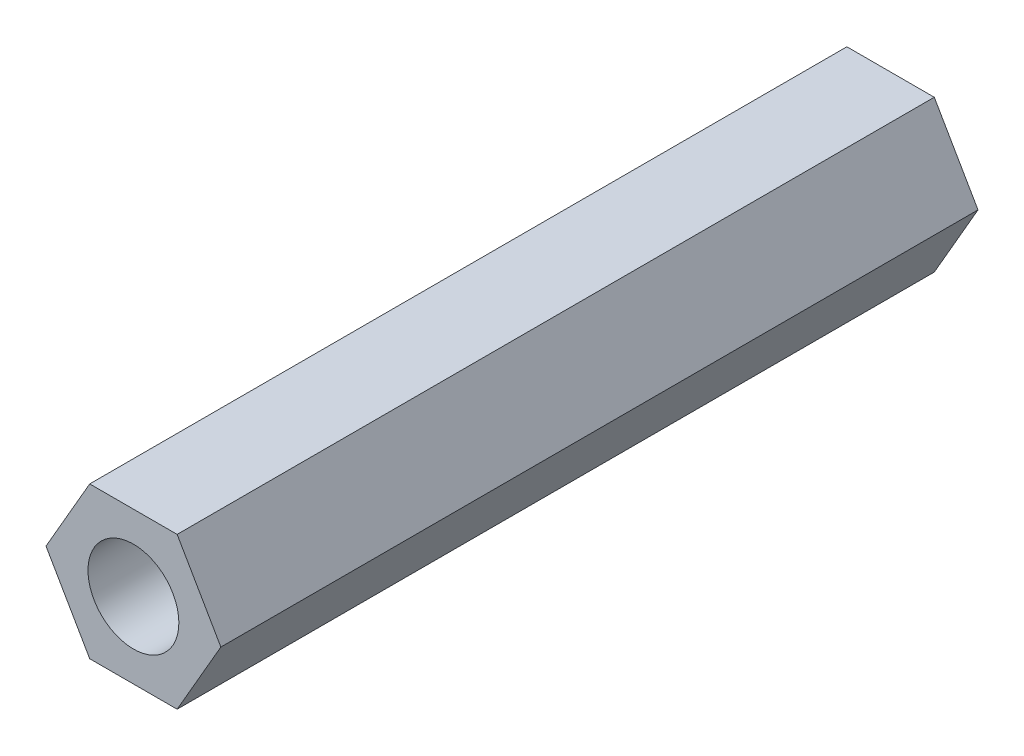
ISO-10303-21;
HEADER;
FILE_DESCRIPTION(('STEP AP214'),'2;1');
FILE_NAME('part.step','',(''),(''),'','','');
FILE_SCHEMA(('AUTOMOTIVE_DESIGN { 1 0 10303 214 1 1 1 1 }'));
ENDSEC;
DATA;
#1=APPLICATION_CONTEXT('core data for automotive mechanical design processes');
#2=APPLICATION_PROTOCOL_DEFINITION('international standard','automotive_design',2000,#1);
#3=PRODUCT_CONTEXT('',#1,'mechanical');
#4=PRODUCT('Part','Part','',(#3));
#5=PRODUCT_RELATED_PRODUCT_CATEGORY('part','',(#4));
#6=PRODUCT_DEFINITION_FORMATION('','',#4);
#7=PRODUCT_DEFINITION_CONTEXT('part definition',#1,'design');
#8=PRODUCT_DEFINITION('design','',#6,#7);
#9=PRODUCT_DEFINITION_SHAPE('','',#8);
#10=(LENGTH_UNIT() NAMED_UNIT(*) SI_UNIT(.MILLI.,.METRE.));
#11=(NAMED_UNIT(*) PLANE_ANGLE_UNIT() SI_UNIT($,.RADIAN.));
#12=(NAMED_UNIT(*) SI_UNIT($,.STERADIAN.) SOLID_ANGLE_UNIT());
#13=UNCERTAINTY_MEASURE_WITH_UNIT(LENGTH_MEASURE(1.E-05),#10,'distance_accuracy_value','');
#14=(GEOMETRIC_REPRESENTATION_CONTEXT(3) GLOBAL_UNCERTAINTY_ASSIGNED_CONTEXT((#13)) GLOBAL_UNIT_ASSIGNED_CONTEXT((#10,
#11,#12)) REPRESENTATION_CONTEXT('',''));
#15=CARTESIAN_POINT('',(0.,0.,0.));
#16=DIRECTION('',(0.,0.,1.));
#17=DIRECTION('',(1.,0.,0.));
#18=AXIS2_PLACEMENT_3D('',#15,#16,#17);
#19=CARTESIAN_POINT('',(0.,0.,25.));
#20=DIRECTION('',(0.,0.,1.));
#21=DIRECTION('',(1.,0.,0.));
#22=AXIS2_PLACEMENT_3D('',#19,#20,#21);
#23=PLANE('',#22);
#24=DIRECTION('',(1.,0.,0.));
#25=VECTOR('',#24,1.);
#26=CARTESIAN_POINT('',(-1.44337567297407,-2.5,25.));
#27=LINE('',#26,#25);
#28=CARTESIAN_POINT('',(-1.44337567297407,-2.5,25.));
#29=VERTEX_POINT('',#28);
#30=CARTESIAN_POINT('',(1.44337567297406,-2.5,25.));
#31=VERTEX_POINT('',#30);
#32=EDGE_CURVE('E133',#29,#31,#27,.T.);
#33=ORIENTED_EDGE('',*,*,#32,.T.);
#34=DIRECTION('',(0.5,0.866025403784438,0.));
#35=VECTOR('',#34,1.);
#36=CARTESIAN_POINT('',(1.44337567297406,-2.5,25.));
#37=LINE('',#36,#35);
#38=CARTESIAN_POINT('',(2.88675134594813,0.,25.));
#39=VERTEX_POINT('',#38);
#40=EDGE_CURVE('E91',#31,#39,#37,.T.);
#41=ORIENTED_EDGE('',*,*,#40,.T.);
#42=DIRECTION('',(-0.5,0.866025403784438,0.));
#43=VECTOR('',#42,1.);
#44=CARTESIAN_POINT('',(2.88675134594813,0.,25.));
#45=LINE('',#44,#43);
#46=CARTESIAN_POINT('',(1.44337567297406,2.5,25.));
#47=VERTEX_POINT('',#46);
#48=EDGE_CURVE('E104',#39,#47,#45,.T.);
#49=ORIENTED_EDGE('',*,*,#48,.T.);
#50=DIRECTION('',(-1.,0.,0.));
#51=VECTOR('',#50,1.);
#52=CARTESIAN_POINT('',(1.44337567297406,2.5,25.));
#53=LINE('',#52,#51);
#54=CARTESIAN_POINT('',(-1.44337567297407,2.5,25.));
#55=VERTEX_POINT('',#54);
#56=EDGE_CURVE('E98',#47,#55,#53,.T.);
#57=ORIENTED_EDGE('',*,*,#56,.T.);
#58=DIRECTION('',(-0.5,-0.866025403784439,0.));
#59=VECTOR('',#58,1.);
#60=CARTESIAN_POINT('',(-1.44337567297407,2.5,25.));
#61=LINE('',#60,#59);
#62=CARTESIAN_POINT('',(-2.88675134594813,0.,25.));
#63=VERTEX_POINT('',#62);
#64=EDGE_CURVE('E102',#55,#63,#61,.T.);
#65=ORIENTED_EDGE('',*,*,#64,.T.);
#66=DIRECTION('',(0.5,-0.866025403784439,0.));
#67=VECTOR('',#66,1.);
#68=CARTESIAN_POINT('',(-2.88675134594813,0.,25.));
#69=LINE('',#68,#67);
#70=EDGE_CURVE('E54',#63,#29,#69,.T.);
#71=ORIENTED_EDGE('',*,*,#70,.T.);
#72=EDGE_LOOP('',(#33,#41,#49,#57,#65,#71));
#73=FACE_BOUND('',#72,.T.);
#74=CARTESIAN_POINT('',(0.,0.,25.));
#75=DIRECTION('',(0.,0.,1.));
#76=DIRECTION('',(1.,0.,0.));
#77=AXIS2_PLACEMENT_3D('',#74,#75,#76);
#78=CIRCLE('',#77,1.5);
#79=CARTESIAN_POINT('',(1.5,0.,25.));
#80=VERTEX_POINT('',#79);
#81=EDGE_CURVE('E126',#80,#80,#78,.T.);
#82=ORIENTED_EDGE('',*,*,#81,.F.);
#83=EDGE_LOOP('',(#82));
#84=FACE_BOUND('',#83,.T.);
#85=ADVANCED_FACE('F37',(#73,#84),#23,.T.);
#86=CARTESIAN_POINT('',(0.,0.,0.));
#87=DIRECTION('',(0.,0.,1.));
#88=DIRECTION('',(1.,0.,0.));
#89=AXIS2_PLACEMENT_3D('',#86,#87,#88);
#90=PLANE('',#89);
#91=DIRECTION('',(1.,0.,0.));
#92=VECTOR('',#91,1.);
#93=CARTESIAN_POINT('',(-1.44337567297407,-2.5,0.));
#94=LINE('',#93,#92);
#95=CARTESIAN_POINT('',(-1.44337567297407,-2.5,0.));
#96=VERTEX_POINT('',#95);
#97=CARTESIAN_POINT('',(1.44337567297406,-2.5,0.));
#98=VERTEX_POINT('',#97);
#99=EDGE_CURVE('E122',#96,#98,#94,.T.);
#100=ORIENTED_EDGE('',*,*,#99,.F.);
#101=DIRECTION('',(0.5,-0.866025403784439,0.));
#102=VECTOR('',#101,1.);
#103=CARTESIAN_POINT('',(-2.88675134594813,0.,0.));
#104=LINE('',#103,#102);
#105=CARTESIAN_POINT('',(-2.88675134594813,0.,0.));
#106=VERTEX_POINT('',#105);
#107=EDGE_CURVE('E83',#106,#96,#104,.T.);
#108=ORIENTED_EDGE('',*,*,#107,.F.);
#109=DIRECTION('',(-0.5,-0.866025403784439,0.));
#110=VECTOR('',#109,1.);
#111=CARTESIAN_POINT('',(-1.44337567297407,2.5,0.));
#112=LINE('',#111,#110);
#113=CARTESIAN_POINT('',(-1.44337567297407,2.5,0.));
#114=VERTEX_POINT('',#113);
#115=EDGE_CURVE('E77',#114,#106,#112,.T.);
#116=ORIENTED_EDGE('',*,*,#115,.F.);
#117=DIRECTION('',(-1.,0.,0.));
#118=VECTOR('',#117,1.);
#119=CARTESIAN_POINT('',(1.44337567297406,2.5,0.));
#120=LINE('',#119,#118);
#121=CARTESIAN_POINT('',(1.44337567297406,2.5,0.));
#122=VERTEX_POINT('',#121);
#123=EDGE_CURVE('E112',#122,#114,#120,.T.);
#124=ORIENTED_EDGE('',*,*,#123,.F.);
#125=DIRECTION('',(-0.5,0.866025403784438,0.));
#126=VECTOR('',#125,1.);
#127=CARTESIAN_POINT('',(2.88675134594813,0.,0.));
#128=LINE('',#127,#126);
#129=CARTESIAN_POINT('',(2.88675134594813,0.,0.));
#130=VERTEX_POINT('',#129);
#131=EDGE_CURVE('E128',#130,#122,#128,.T.);
#132=ORIENTED_EDGE('',*,*,#131,.F.);
#133=DIRECTION('',(0.5,0.866025403784438,0.));
#134=VECTOR('',#133,1.);
#135=CARTESIAN_POINT('',(1.44337567297406,-2.5,0.));
#136=LINE('',#135,#134);
#137=EDGE_CURVE('E125',#98,#130,#136,.T.);
#138=ORIENTED_EDGE('',*,*,#137,.F.);
#139=EDGE_LOOP('',(#100,#108,#116,#124,#132,#138));
#140=FACE_BOUND('',#139,.T.);
#141=CARTESIAN_POINT('',(0.,0.,0.));
#142=DIRECTION('',(0.,0.,1.));
#143=DIRECTION('',(1.,0.,0.));
#144=AXIS2_PLACEMENT_3D('',#141,#142,#143);
#145=CIRCLE('',#144,1.5);
#146=CARTESIAN_POINT('',(1.5,0.,0.));
#147=VERTEX_POINT('',#146);
#148=EDGE_CURVE('E226',#147,#147,#145,.T.);
#149=ORIENTED_EDGE('',*,*,#148,.T.);
#150=EDGE_LOOP('',(#149));
#151=FACE_BOUND('',#150,.T.);
#152=ADVANCED_FACE('F142',(#140,#151),#90,.F.);
#153=CARTESIAN_POINT('',(-1.44337567297407,-2.5,25.));
#154=DIRECTION('',(0.,1.,0.));
#155=DIRECTION('',(0.,0.,1.));
#156=AXIS2_PLACEMENT_3D('',#153,#154,#155);
#157=PLANE('',#156);
#158=ORIENTED_EDGE('',*,*,#99,.T.);
#159=DIRECTION('',(0.,0.,-1.));
#160=VECTOR('',#159,1.);
#161=CARTESIAN_POINT('',(1.44337567297406,-2.5,25.));
#162=LINE('',#161,#160);
#163=EDGE_CURVE('E11',#31,#98,#162,.T.);
#164=ORIENTED_EDGE('',*,*,#163,.F.);
#165=ORIENTED_EDGE('',*,*,#32,.F.);
#166=DIRECTION('',(0.,0.,-1.));
#167=VECTOR('',#166,1.);
#168=CARTESIAN_POINT('',(-1.44337567297407,-2.5,25.));
#169=LINE('',#168,#167);
#170=EDGE_CURVE('E118',#29,#96,#169,.T.);
#171=ORIENTED_EDGE('',*,*,#170,.T.);
#172=EDGE_LOOP('',(#158,#164,#165,#171));
#173=FACE_BOUND('',#172,.T.);
#174=ADVANCED_FACE('F39',(#173),#157,.F.);
#175=CARTESIAN_POINT('',(1.44337567297406,-2.5,25.));
#176=DIRECTION('',(-0.866025403784438,0.5,0.));
#177=DIRECTION('',(-0.5,-0.866025403784439,0.));
#178=AXIS2_PLACEMENT_3D('',#175,#176,#177);
#179=PLANE('',#178);
#180=ORIENTED_EDGE('',*,*,#137,.T.);
#181=DIRECTION('',(0.,0.,-1.));
#182=VECTOR('',#181,1.);
#183=CARTESIAN_POINT('',(2.88675134594813,0.,25.));
#184=LINE('',#183,#182);
#185=EDGE_CURVE('E46',#39,#130,#184,.T.);
#186=ORIENTED_EDGE('',*,*,#185,.F.);
#187=ORIENTED_EDGE('',*,*,#40,.F.);
#188=ORIENTED_EDGE('',*,*,#163,.T.);
#189=EDGE_LOOP('',(#180,#186,#187,#188));
#190=FACE_BOUND('',#189,.T.);
#191=ADVANCED_FACE('F167',(#190),#179,.F.);
#192=CARTESIAN_POINT('',(2.88675134594813,0.,25.));
#193=DIRECTION('',(-0.866025403784438,-0.5,0.));
#194=DIRECTION('',(0.5,-0.866025403784438,0.));
#195=AXIS2_PLACEMENT_3D('',#192,#193,#194);
#196=PLANE('',#195);
#197=ORIENTED_EDGE('',*,*,#131,.T.);
#198=DIRECTION('',(0.,0.,-1.));
#199=VECTOR('',#198,1.);
#200=CARTESIAN_POINT('',(1.44337567297406,2.5,25.));
#201=LINE('',#200,#199);
#202=EDGE_CURVE('E113',#47,#122,#201,.T.);
#203=ORIENTED_EDGE('',*,*,#202,.F.);
#204=ORIENTED_EDGE('',*,*,#48,.F.);
#205=ORIENTED_EDGE('',*,*,#185,.T.);
#206=EDGE_LOOP('',(#197,#203,#204,#205));
#207=FACE_BOUND('',#206,.T.);
#208=ADVANCED_FACE('F139',(#207),#196,.F.);
#209=CARTESIAN_POINT('',(1.44337567297406,2.5,25.));
#210=DIRECTION('',(0.,-1.,0.));
#211=DIRECTION('',(1.,0.,0.));
#212=AXIS2_PLACEMENT_3D('',#209,#210,#211);
#213=PLANE('',#212);
#214=ORIENTED_EDGE('',*,*,#123,.T.);
#215=DIRECTION('',(0.,0.,-1.));
#216=VECTOR('',#215,1.);
#217=CARTESIAN_POINT('',(-1.44337567297407,2.5,25.));
#218=LINE('',#217,#216);
#219=EDGE_CURVE('E109',#55,#114,#218,.T.);
#220=ORIENTED_EDGE('',*,*,#219,.F.);
#221=ORIENTED_EDGE('',*,*,#56,.F.);
#222=ORIENTED_EDGE('',*,*,#202,.T.);
#223=EDGE_LOOP('',(#214,#220,#221,#222));
#224=FACE_BOUND('',#223,.T.);
#225=ADVANCED_FACE('F110',(#224),#213,.F.);
#226=CARTESIAN_POINT('',(-1.44337567297407,2.5,25.));
#227=DIRECTION('',(0.866025403784439,-0.5,0.));
#228=DIRECTION('',(0.5,0.866025403784439,0.));
#229=AXIS2_PLACEMENT_3D('',#226,#227,#228);
#230=PLANE('',#229);
#231=ORIENTED_EDGE('',*,*,#115,.T.);
#232=DIRECTION('',(0.,0.,-1.));
#233=VECTOR('',#232,1.);
#234=CARTESIAN_POINT('',(-2.88675134594813,0.,25.));
#235=LINE('',#234,#233);
#236=EDGE_CURVE('E114',#63,#106,#235,.T.);
#237=ORIENTED_EDGE('',*,*,#236,.F.);
#238=ORIENTED_EDGE('',*,*,#64,.F.);
#239=ORIENTED_EDGE('',*,*,#219,.T.);
#240=EDGE_LOOP('',(#231,#237,#238,#239));
#241=FACE_BOUND('',#240,.T.);
#242=ADVANCED_FACE('F116',(#241),#230,.F.);
#243=CARTESIAN_POINT('',(-2.88675134594813,0.,25.));
#244=DIRECTION('',(0.866025403784438,0.5,0.));
#245=DIRECTION('',(-0.5,0.866025403784439,0.));
#246=AXIS2_PLACEMENT_3D('',#243,#244,#245);
#247=PLANE('',#246);
#248=ORIENTED_EDGE('',*,*,#107,.T.);
#249=ORIENTED_EDGE('',*,*,#170,.F.);
#250=ORIENTED_EDGE('',*,*,#70,.F.);
#251=ORIENTED_EDGE('',*,*,#236,.T.);
#252=EDGE_LOOP('',(#248,#249,#250,#251));
#253=FACE_BOUND('',#252,.T.);
#254=ADVANCED_FACE('F147',(#253),#247,.F.);
#255=CARTESIAN_POINT('',(0.,0.,25.));
#256=DIRECTION('',(0.,0.,-1.));
#257=DIRECTION('',(-1.,0.,0.));
#258=AXIS2_PLACEMENT_3D('',#255,#256,#257);
#259=CYLINDRICAL_SURFACE('',#258,1.5);
#260=ORIENTED_EDGE('',*,*,#81,.T.);
#261=EDGE_LOOP('',(#260));
#262=FACE_BOUND('',#261,.T.);
#263=ORIENTED_EDGE('',*,*,#148,.F.);
#264=EDGE_LOOP('',(#263));
#265=FACE_BOUND('',#264,.T.);
#266=ADVANCED_FACE('F149',(#262,#265),#259,.F.);
#267=CLOSED_SHELL('',(#85,#152,#174,#191,#208,#225,#242,#254,#266));
#268=MANIFOLD_SOLID_BREP('B2',#267);
#269=ADVANCED_BREP_SHAPE_REPRESENTATION('',(#18,#268),#14);
#270=SHAPE_DEFINITION_REPRESENTATION(#9,#269);
ENDSEC;
END-ISO-10303-21;
